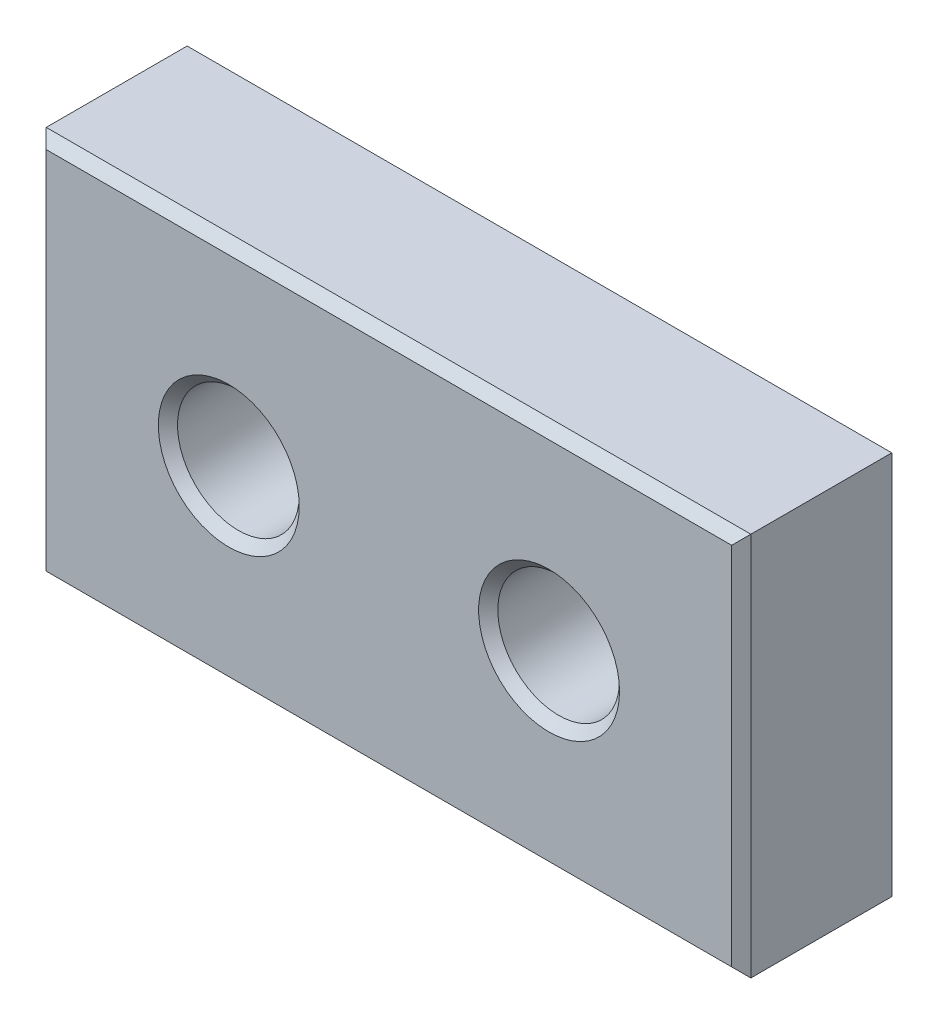
ISO-10303-21;
HEADER;
FILE_DESCRIPTION(('STEP AP214'),'2;1');
FILE_NAME('part.step','',(''),(''),'','','');
FILE_SCHEMA(('AUTOMOTIVE_DESIGN { 1 0 10303 214 1 1 1 1 }'));
ENDSEC;
DATA;
#1=APPLICATION_CONTEXT('core data for automotive mechanical design processes');
#2=APPLICATION_PROTOCOL_DEFINITION('international standard','automotive_design',2000,#1);
#3=PRODUCT_CONTEXT('',#1,'mechanical');
#4=PRODUCT('Part','Part','',(#3));
#5=PRODUCT_RELATED_PRODUCT_CATEGORY('part','',(#4));
#6=PRODUCT_DEFINITION_FORMATION('','',#4);
#7=PRODUCT_DEFINITION_CONTEXT('part definition',#1,'design');
#8=PRODUCT_DEFINITION('design','',#6,#7);
#9=PRODUCT_DEFINITION_SHAPE('','',#8);
#10=(LENGTH_UNIT() NAMED_UNIT(*) SI_UNIT(.MILLI.,.METRE.));
#11=(NAMED_UNIT(*) PLANE_ANGLE_UNIT() SI_UNIT($,.RADIAN.));
#12=(NAMED_UNIT(*) SI_UNIT($,.STERADIAN.) SOLID_ANGLE_UNIT());
#13=UNCERTAINTY_MEASURE_WITH_UNIT(LENGTH_MEASURE(1.E-05),#10,'distance_accuracy_value','');
#14=(GEOMETRIC_REPRESENTATION_CONTEXT(3) GLOBAL_UNCERTAINTY_ASSIGNED_CONTEXT((#13)) GLOBAL_UNIT_ASSIGNED_CONTEXT((#10,
#11,#12)) REPRESENTATION_CONTEXT('',''));
#15=CARTESIAN_POINT('',(0.,0.,0.));
#16=DIRECTION('',(0.,0.,1.));
#17=DIRECTION('',(1.,0.,0.));
#18=AXIS2_PLACEMENT_3D('',#15,#16,#17);
#19=CARTESIAN_POINT('',(0.,0.,5.));
#20=DIRECTION('',(0.,0.,1.));
#21=DIRECTION('',(1.,0.,0.));
#22=AXIS2_PLACEMENT_3D('',#19,#20,#21);
#23=PLANE('',#22);
#24=CARTESIAN_POINT('',(5.,0.,5.));
#25=DIRECTION('',(0.,0.,1.));
#26=DIRECTION('',(1.,0.,0.));
#27=AXIS2_PLACEMENT_3D('',#24,#25,#26);
#28=CIRCLE('',#27,2.2);
#29=CARTESIAN_POINT('',(7.2,0.,5.));
#30=VERTEX_POINT('',#29);
#31=EDGE_CURVE('E11',#30,#30,#28,.F.);
#32=ORIENTED_EDGE('',*,*,#31,.T.);
#33=EDGE_LOOP('',(#32));
#34=FACE_BOUND('',#33,.T.);
#35=DIRECTION('',(0.,-1.,0.));
#36=VECTOR('',#35,1.);
#37=CARTESIAN_POINT('',(-10.7,-6.,5.));
#38=LINE('',#37,#36);
#39=CARTESIAN_POINT('',(-10.7,5.69999999999999,5.));
#40=VERTEX_POINT('',#39);
#41=CARTESIAN_POINT('',(-10.7,-5.69999999999999,5.));
#42=VERTEX_POINT('',#41);
#43=EDGE_CURVE('E59',#40,#42,#38,.T.);
#44=ORIENTED_EDGE('',*,*,#43,.T.);
#45=DIRECTION('',(1.,0.,0.));
#46=VECTOR('',#45,1.);
#47=CARTESIAN_POINT('',(11.,-5.69999999999999,5.));
#48=LINE('',#47,#46);
#49=CARTESIAN_POINT('',(10.7,-5.69999999999999,5.));
#50=VERTEX_POINT('',#49);
#51=EDGE_CURVE('E51',#42,#50,#48,.T.);
#52=ORIENTED_EDGE('',*,*,#51,.T.);
#53=DIRECTION('',(0.,1.,0.));
#54=VECTOR('',#53,1.);
#55=CARTESIAN_POINT('',(10.7,6.,5.));
#56=LINE('',#55,#54);
#57=CARTESIAN_POINT('',(10.7,5.69999999999999,5.));
#58=VERTEX_POINT('',#57);
#59=EDGE_CURVE('E196',#50,#58,#56,.T.);
#60=ORIENTED_EDGE('',*,*,#59,.T.);
#61=DIRECTION('',(-1.,0.,0.));
#62=VECTOR('',#61,1.);
#63=CARTESIAN_POINT('',(-11.,5.69999999999999,5.));
#64=LINE('',#63,#62);
#65=EDGE_CURVE('E64',#58,#40,#64,.T.);
#66=ORIENTED_EDGE('',*,*,#65,.T.);
#67=EDGE_LOOP('',(#44,#52,#60,#66));
#68=FACE_BOUND('',#67,.T.);
#69=CARTESIAN_POINT('',(-5.,0.,5.));
#70=DIRECTION('',(0.,0.,1.));
#71=DIRECTION('',(1.,0.,0.));
#72=AXIS2_PLACEMENT_3D('',#69,#70,#71);
#73=CIRCLE('',#72,2.2);
#74=CARTESIAN_POINT('',(-2.8,0.,5.));
#75=VERTEX_POINT('',#74);
#76=EDGE_CURVE('E192',#75,#75,#73,.F.);
#77=ORIENTED_EDGE('',*,*,#76,.T.);
#78=EDGE_LOOP('',(#77));
#79=FACE_BOUND('',#78,.T.);
#80=ADVANCED_FACE('F40',(#34,#68,#79),#23,.T.);
#81=CARTESIAN_POINT('',(0.,0.,0.));
#82=DIRECTION('',(0.,0.,1.));
#83=DIRECTION('',(1.,0.,0.));
#84=AXIS2_PLACEMENT_3D('',#81,#82,#83);
#85=PLANE('',#84);
#86=CARTESIAN_POINT('',(5.,0.,0.));
#87=DIRECTION('',(0.,0.,1.));
#88=DIRECTION('',(1.,0.,0.));
#89=AXIS2_PLACEMENT_3D('',#86,#87,#88);
#90=CIRCLE('',#89,2.2);
#91=CARTESIAN_POINT('',(7.2,0.,0.));
#92=VERTEX_POINT('',#91);
#93=EDGE_CURVE('E144',#92,#92,#90,.T.);
#94=ORIENTED_EDGE('',*,*,#93,.T.);
#95=EDGE_LOOP('',(#94));
#96=FACE_BOUND('',#95,.T.);
#97=CARTESIAN_POINT('',(-5.,0.,0.));
#98=DIRECTION('',(0.,0.,1.));
#99=DIRECTION('',(1.,0.,0.));
#100=AXIS2_PLACEMENT_3D('',#97,#98,#99);
#101=CIRCLE('',#100,2.2);
#102=CARTESIAN_POINT('',(-2.8,0.,0.));
#103=VERTEX_POINT('',#102);
#104=EDGE_CURVE('E139',#103,#103,#101,.T.);
#105=ORIENTED_EDGE('',*,*,#104,.T.);
#106=EDGE_LOOP('',(#105));
#107=FACE_BOUND('',#106,.T.);
#108=DIRECTION('',(0.,1.,0.));
#109=VECTOR('',#108,1.);
#110=CARTESIAN_POINT('',(-10.7,0.,0.));
#111=LINE('',#110,#109);
#112=CARTESIAN_POINT('',(-10.7,-5.7,0.));
#113=VERTEX_POINT('',#112);
#114=CARTESIAN_POINT('',(-10.7,5.7,0.));
#115=VERTEX_POINT('',#114);
#116=EDGE_CURVE('E137',#113,#115,#111,.T.);
#117=ORIENTED_EDGE('',*,*,#116,.T.);
#118=DIRECTION('',(1.,0.,0.));
#119=VECTOR('',#118,1.);
#120=CARTESIAN_POINT('',(0.,5.7,0.));
#121=LINE('',#120,#119);
#122=CARTESIAN_POINT('',(10.7,5.7,0.));
#123=VERTEX_POINT('',#122);
#124=EDGE_CURVE('E114',#115,#123,#121,.T.);
#125=ORIENTED_EDGE('',*,*,#124,.T.);
#126=DIRECTION('',(0.,-1.,0.));
#127=VECTOR('',#126,1.);
#128=CARTESIAN_POINT('',(10.7,0.,0.));
#129=LINE('',#128,#127);
#130=CARTESIAN_POINT('',(10.7,-5.7,0.));
#131=VERTEX_POINT('',#130);
#132=EDGE_CURVE('E125',#123,#131,#129,.T.);
#133=ORIENTED_EDGE('',*,*,#132,.T.);
#134=DIRECTION('',(-1.,0.,0.));
#135=VECTOR('',#134,1.);
#136=CARTESIAN_POINT('',(0.,-5.7,0.));
#137=LINE('',#136,#135);
#138=EDGE_CURVE('E132',#131,#113,#137,.T.);
#139=ORIENTED_EDGE('',*,*,#138,.T.);
#140=EDGE_LOOP('',(#117,#125,#133,#139));
#141=FACE_BOUND('',#140,.T.);
#142=ADVANCED_FACE('F135',(#96,#107,#141),#85,.F.);
#143=CARTESIAN_POINT('',(11.,6.,5.));
#144=DIRECTION('',(-1.,0.,0.));
#145=DIRECTION('',(0.,0.,1.));
#146=AXIS2_PLACEMENT_3D('',#143,#144,#145);
#147=PLANE('',#146);
#148=DIRECTION('',(0.,0.,-1.));
#149=VECTOR('',#148,1.);
#150=CARTESIAN_POINT('',(11.,-6.,5.));
#151=LINE('',#150,#149);
#152=CARTESIAN_POINT('',(11.,-6.,4.69999999999999));
#153=VERTEX_POINT('',#152);
#154=CARTESIAN_POINT('',(11.,-6.,0.299999999999995));
#155=VERTEX_POINT('',#154);
#156=EDGE_CURVE('E212',#153,#155,#151,.T.);
#157=ORIENTED_EDGE('',*,*,#156,.T.);
#158=DIRECTION('',(0.,1.,0.));
#159=VECTOR('',#158,1.);
#160=CARTESIAN_POINT('',(11.,6.,0.299999999999995));
#161=LINE('',#160,#159);
#162=CARTESIAN_POINT('',(11.,6.,0.299999999999995));
#163=VERTEX_POINT('',#162);
#164=EDGE_CURVE('E189',#155,#163,#161,.T.);
#165=ORIENTED_EDGE('',*,*,#164,.T.);
#166=DIRECTION('',(0.,0.,-1.));
#167=VECTOR('',#166,1.);
#168=CARTESIAN_POINT('',(11.,6.,5.));
#169=LINE('',#168,#167);
#170=CARTESIAN_POINT('',(11.,6.,4.69999999999999));
#171=VERTEX_POINT('',#170);
#172=EDGE_CURVE('E133',#171,#163,#169,.T.);
#173=ORIENTED_EDGE('',*,*,#172,.F.);
#174=DIRECTION('',(0.,-1.,0.));
#175=VECTOR('',#174,1.);
#176=CARTESIAN_POINT('',(11.,-6.,4.69999999999999));
#177=LINE('',#176,#175);
#178=EDGE_CURVE('E186',#171,#153,#177,.T.);
#179=ORIENTED_EDGE('',*,*,#178,.T.);
#180=EDGE_LOOP('',(#157,#165,#173,#179));
#181=FACE_BOUND('',#180,.T.);
#182=ADVANCED_FACE('F242',(#181),#147,.F.);
#183=CARTESIAN_POINT('',(-11.,6.,5.));
#184=DIRECTION('',(0.,-1.,0.));
#185=DIRECTION('',(0.,0.,-1.));
#186=AXIS2_PLACEMENT_3D('',#183,#184,#185);
#187=PLANE('',#186);
#188=ORIENTED_EDGE('',*,*,#172,.T.);
#189=DIRECTION('',(-1.,0.,0.));
#190=VECTOR('',#189,1.);
#191=CARTESIAN_POINT('',(-11.,6.,0.299999999999995));
#192=LINE('',#191,#190);
#193=CARTESIAN_POINT('',(-11.,6.,0.299999999999995));
#194=VERTEX_POINT('',#193);
#195=EDGE_CURVE('E117',#163,#194,#192,.T.);
#196=ORIENTED_EDGE('',*,*,#195,.T.);
#197=DIRECTION('',(0.,0.,-1.));
#198=VECTOR('',#197,1.);
#199=CARTESIAN_POINT('',(-11.,6.,5.));
#200=LINE('',#199,#198);
#201=CARTESIAN_POINT('',(-11.,6.,4.69999999999999));
#202=VERTEX_POINT('',#201);
#203=EDGE_CURVE('E239',#202,#194,#200,.T.);
#204=ORIENTED_EDGE('',*,*,#203,.F.);
#205=DIRECTION('',(1.,0.,0.));
#206=VECTOR('',#205,1.);
#207=CARTESIAN_POINT('',(11.,6.,4.69999999999999));
#208=LINE('',#207,#206);
#209=EDGE_CURVE('E168',#202,#171,#208,.T.);
#210=ORIENTED_EDGE('',*,*,#209,.T.);
#211=EDGE_LOOP('',(#188,#196,#204,#210));
#212=FACE_BOUND('',#211,.T.);
#213=ADVANCED_FACE('F237',(#212),#187,.F.);
#214=CARTESIAN_POINT('',(-11.,6.,5.));
#215=DIRECTION('',(1.,0.,0.));
#216=DIRECTION('',(0.,0.,-1.));
#217=AXIS2_PLACEMENT_3D('',#214,#215,#216);
#218=PLANE('',#217);
#219=ORIENTED_EDGE('',*,*,#203,.T.);
#220=DIRECTION('',(0.,-1.,0.));
#221=VECTOR('',#220,1.);
#222=CARTESIAN_POINT('',(-11.,6.,0.299999999999995));
#223=LINE('',#222,#221);
#224=CARTESIAN_POINT('',(-11.,-6.,0.299999999999995));
#225=VERTEX_POINT('',#224);
#226=EDGE_CURVE('E176',#194,#225,#223,.T.);
#227=ORIENTED_EDGE('',*,*,#226,.T.);
#228=DIRECTION('',(0.,0.,-1.));
#229=VECTOR('',#228,1.);
#230=CARTESIAN_POINT('',(-11.,-6.,5.));
#231=LINE('',#230,#229);
#232=CARTESIAN_POINT('',(-11.,-6.,4.69999999999999));
#233=VERTEX_POINT('',#232);
#234=EDGE_CURVE('E247',#233,#225,#231,.T.);
#235=ORIENTED_EDGE('',*,*,#234,.F.);
#236=DIRECTION('',(0.,1.,0.));
#237=VECTOR('',#236,1.);
#238=CARTESIAN_POINT('',(-11.,6.,4.69999999999999));
#239=LINE('',#238,#237);
#240=EDGE_CURVE('E173',#233,#202,#239,.T.);
#241=ORIENTED_EDGE('',*,*,#240,.T.);
#242=EDGE_LOOP('',(#219,#227,#235,#241));
#243=FACE_BOUND('',#242,.T.);
#244=ADVANCED_FACE('F261',(#243),#218,.F.);
#245=CARTESIAN_POINT('',(-11.,-6.,5.));
#246=DIRECTION('',(0.,1.,0.));
#247=DIRECTION('',(0.,0.,1.));
#248=AXIS2_PLACEMENT_3D('',#245,#246,#247);
#249=PLANE('',#248);
#250=ORIENTED_EDGE('',*,*,#234,.T.);
#251=DIRECTION('',(1.,0.,0.));
#252=VECTOR('',#251,1.);
#253=CARTESIAN_POINT('',(-11.,-6.,0.299999999999995));
#254=LINE('',#253,#252);
#255=EDGE_CURVE('E183',#225,#155,#254,.T.);
#256=ORIENTED_EDGE('',*,*,#255,.T.);
#257=ORIENTED_EDGE('',*,*,#156,.F.);
#258=DIRECTION('',(-1.,0.,0.));
#259=VECTOR('',#258,1.);
#260=CARTESIAN_POINT('',(-11.,-6.,4.69999999999999));
#261=LINE('',#260,#259);
#262=EDGE_CURVE('E179',#153,#233,#261,.T.);
#263=ORIENTED_EDGE('',*,*,#262,.T.);
#264=EDGE_LOOP('',(#250,#256,#257,#263));
#265=FACE_BOUND('',#264,.T.);
#266=ADVANCED_FACE('F267',(#265),#249,.F.);
#267=CARTESIAN_POINT('',(-5.,0.,5.));
#268=DIRECTION('',(0.,0.,-1.));
#269=DIRECTION('',(-1.,0.,0.));
#270=AXIS2_PLACEMENT_3D('',#267,#268,#269);
#271=CYLINDRICAL_SURFACE('',#270,1.9);
#272=CARTESIAN_POINT('',(-5.,0.,0.300000000000003));
#273=DIRECTION('',(0.,0.,1.));
#274=DIRECTION('',(1.,0.,0.));
#275=AXIS2_PLACEMENT_3D('',#272,#273,#274);
#276=CIRCLE('',#275,1.9);
#277=CARTESIAN_POINT('',(-3.1,0.,0.300000000000003));
#278=VERTEX_POINT('',#277);
#279=EDGE_CURVE('E164',#278,#278,#276,.F.);
#280=ORIENTED_EDGE('',*,*,#279,.T.);
#281=EDGE_LOOP('',(#280));
#282=FACE_BOUND('',#281,.T.);
#283=CARTESIAN_POINT('',(-5.,0.,4.7));
#284=DIRECTION('',(0.,0.,1.));
#285=DIRECTION('',(1.,0.,0.));
#286=AXIS2_PLACEMENT_3D('',#283,#284,#285);
#287=CIRCLE('',#286,1.9);
#288=CARTESIAN_POINT('',(-3.1,0.,4.7));
#289=VERTEX_POINT('',#288);
#290=EDGE_CURVE('E160',#289,#289,#287,.T.);
#291=ORIENTED_EDGE('',*,*,#290,.T.);
#292=EDGE_LOOP('',(#291));
#293=FACE_BOUND('',#292,.T.);
#294=ADVANCED_FACE('F283',(#282,#293),#271,.F.);
#295=CARTESIAN_POINT('',(5.,0.,5.));
#296=DIRECTION('',(0.,0.,-1.));
#297=DIRECTION('',(-1.,0.,0.));
#298=AXIS2_PLACEMENT_3D('',#295,#296,#297);
#299=CYLINDRICAL_SURFACE('',#298,1.9);
#300=CARTESIAN_POINT('',(5.,0.,0.300000000000003));
#301=DIRECTION('',(0.,0.,1.));
#302=DIRECTION('',(1.,0.,0.));
#303=AXIS2_PLACEMENT_3D('',#300,#301,#302);
#304=CIRCLE('',#303,1.9);
#305=CARTESIAN_POINT('',(6.9,0.,0.300000000000003));
#306=VERTEX_POINT('',#305);
#307=EDGE_CURVE('E156',#306,#306,#304,.F.);
#308=ORIENTED_EDGE('',*,*,#307,.T.);
#309=EDGE_LOOP('',(#308));
#310=FACE_BOUND('',#309,.T.);
#311=CARTESIAN_POINT('',(5.,0.,4.7));
#312=DIRECTION('',(0.,0.,1.));
#313=DIRECTION('',(1.,0.,0.));
#314=AXIS2_PLACEMENT_3D('',#311,#312,#313);
#315=CIRCLE('',#314,1.9);
#316=CARTESIAN_POINT('',(6.9,0.,4.7));
#317=VERTEX_POINT('',#316);
#318=EDGE_CURVE('E152',#317,#317,#315,.T.);
#319=ORIENTED_EDGE('',*,*,#318,.T.);
#320=EDGE_LOOP('',(#319));
#321=FACE_BOUND('',#320,.T.);
#322=ADVANCED_FACE('F285',(#310,#321),#299,.F.);
#323=CARTESIAN_POINT('',(5.,0.,0.));
#324=DIRECTION('',(0.,0.,-1.));
#325=DIRECTION('',(-1.,0.,0.));
#326=AXIS2_PLACEMENT_3D('',#323,#324,#325);
#327=CONICAL_SURFACE('',#326,2.2,0.785398163397444);
#328=ORIENTED_EDGE('',*,*,#307,.F.);
#329=EDGE_LOOP('',(#328));
#330=FACE_BOUND('',#329,.T.);
#331=ORIENTED_EDGE('',*,*,#93,.F.);
#332=EDGE_LOOP('',(#331));
#333=FACE_BOUND('',#332,.T.);
#334=ADVANCED_FACE('F292',(#330,#333),#327,.F.);
#335=CARTESIAN_POINT('',(-5.,0.,0.));
#336=DIRECTION('',(0.,0.,-1.));
#337=DIRECTION('',(-1.,0.,0.));
#338=AXIS2_PLACEMENT_3D('',#335,#336,#337);
#339=CONICAL_SURFACE('',#338,2.2,0.785398163397445);
#340=ORIENTED_EDGE('',*,*,#279,.F.);
#341=EDGE_LOOP('',(#340));
#342=FACE_BOUND('',#341,.T.);
#343=ORIENTED_EDGE('',*,*,#104,.F.);
#344=EDGE_LOOP('',(#343));
#345=FACE_BOUND('',#344,.T.);
#346=ADVANCED_FACE('F312',(#342,#345),#339,.F.);
#347=CARTESIAN_POINT('',(-11.,-6.,0.299999999999995));
#348=DIRECTION('',(0.,0.707106781186543,0.707106781186552));
#349=DIRECTION('',(1.,0.,0.));
#350=AXIS2_PLACEMENT_3D('',#347,#348,#349);
#351=PLANE('',#350);
#352=DIRECTION('',(0.577350269189628,0.577350269189628,-0.577350269189622));
#353=VECTOR('',#352,1.);
#354=CARTESIAN_POINT('',(-11.,-6.,0.299999999999995));
#355=LINE('',#354,#353);
#356=EDGE_CURVE('E121',#113,#225,#355,.F.);
#357=ORIENTED_EDGE('',*,*,#356,.F.);
#358=ORIENTED_EDGE('',*,*,#138,.F.);
#359=DIRECTION('',(-0.577350269189628,0.577350269189628,-0.577350269189622));
#360=VECTOR('',#359,1.);
#361=CARTESIAN_POINT('',(6.99999999999997,-1.99999999999997,-3.69999999999999));
#362=LINE('',#361,#360);
#363=EDGE_CURVE('E128',#155,#131,#362,.T.);
#364=ORIENTED_EDGE('',*,*,#363,.F.);
#365=ORIENTED_EDGE('',*,*,#255,.F.);
#366=EDGE_LOOP('',(#357,#358,#364,#365));
#367=FACE_BOUND('',#366,.T.);
#368=ADVANCED_FACE('F254',(#367),#351,.F.);
#369=CARTESIAN_POINT('',(11.,6.,0.299999999999995));
#370=DIRECTION('',(-0.707106781186543,0.,0.707106781186552));
#371=DIRECTION('',(0.,1.,0.));
#372=AXIS2_PLACEMENT_3D('',#369,#370,#371);
#373=PLANE('',#372);
#374=ORIENTED_EDGE('',*,*,#363,.T.);
#375=ORIENTED_EDGE('',*,*,#132,.F.);
#376=DIRECTION('',(0.577350269189628,0.577350269189628,0.577350269189622));
#377=VECTOR('',#376,1.);
#378=CARTESIAN_POINT('',(11.,6.,0.299999999999995));
#379=LINE('',#378,#377);
#380=EDGE_CURVE('E110',#163,#123,#379,.F.);
#381=ORIENTED_EDGE('',*,*,#380,.F.);
#382=ORIENTED_EDGE('',*,*,#164,.F.);
#383=EDGE_LOOP('',(#374,#375,#381,#382));
#384=FACE_BOUND('',#383,.T.);
#385=ADVANCED_FACE('F126',(#384),#373,.F.);
#386=CARTESIAN_POINT('',(-11.,6.,0.299999999999995));
#387=DIRECTION('',(0.707106781186543,0.,0.707106781186552));
#388=DIRECTION('',(0.,-1.,0.));
#389=AXIS2_PLACEMENT_3D('',#386,#387,#388);
#390=PLANE('',#389);
#391=ORIENTED_EDGE('',*,*,#356,.T.);
#392=ORIENTED_EDGE('',*,*,#226,.F.);
#393=DIRECTION('',(0.577350269189628,-0.577350269189628,-0.577350269189622));
#394=VECTOR('',#393,1.);
#395=CARTESIAN_POINT('',(-11.,6.,0.299999999999995));
#396=LINE('',#395,#394);
#397=EDGE_CURVE('E122',#115,#194,#396,.F.);
#398=ORIENTED_EDGE('',*,*,#397,.F.);
#399=ORIENTED_EDGE('',*,*,#116,.F.);
#400=EDGE_LOOP('',(#391,#392,#398,#399));
#401=FACE_BOUND('',#400,.T.);
#402=ADVANCED_FACE('F257',(#401),#390,.F.);
#403=CARTESIAN_POINT('',(-11.,6.,0.299999999999995));
#404=DIRECTION('',(0.,-0.707106781186543,0.707106781186552));
#405=DIRECTION('',(-1.,0.,0.));
#406=AXIS2_PLACEMENT_3D('',#403,#404,#405);
#407=PLANE('',#406);
#408=ORIENTED_EDGE('',*,*,#380,.T.);
#409=ORIENTED_EDGE('',*,*,#124,.F.);
#410=ORIENTED_EDGE('',*,*,#397,.T.);
#411=ORIENTED_EDGE('',*,*,#195,.F.);
#412=EDGE_LOOP('',(#408,#409,#410,#411));
#413=FACE_BOUND('',#412,.T.);
#414=ADVANCED_FACE('F112',(#413),#407,.F.);
#415=CARTESIAN_POINT('',(5.,0.,4.7));
#416=DIRECTION('',(0.,0.,1.));
#417=DIRECTION('',(1.,0.,0.));
#418=AXIS2_PLACEMENT_3D('',#415,#416,#417);
#419=CONICAL_SURFACE('',#418,1.9,0.785398163397447);
#420=CARTESIAN_POINT('',(7.2,0.,5.));
#421=CARTESIAN_POINT('',(7.196875,0.,4.996875));
#422=CARTESIAN_POINT('',(7.19375,0.,4.99375));
#423=CARTESIAN_POINT('',(7.1875,0.,4.9875));
#424=CARTESIAN_POINT('',(7.184375,0.,4.984375));
#425=CARTESIAN_POINT('',(7.178125,0.,4.978125));
#426=CARTESIAN_POINT('',(7.175,0.,4.975));
#427=CARTESIAN_POINT('',(7.16875,0.,4.96875));
#428=CARTESIAN_POINT('',(7.165625,0.,4.965625));
#429=CARTESIAN_POINT('',(7.159375,0.,4.959375));
#430=CARTESIAN_POINT('',(7.15625,0.,4.95625));
#431=CARTESIAN_POINT('',(7.15,0.,4.95));
#432=CARTESIAN_POINT('',(7.146875,0.,4.946875));
#433=CARTESIAN_POINT('',(7.140625,0.,4.940625));
#434=CARTESIAN_POINT('',(7.1375,0.,4.9375));
#435=CARTESIAN_POINT('',(7.13125,0.,4.93125));
#436=CARTESIAN_POINT('',(7.128125,0.,4.928125));
#437=CARTESIAN_POINT('',(7.121875,0.,4.921875));
#438=CARTESIAN_POINT('',(7.11875,0.,4.91875));
#439=CARTESIAN_POINT('',(7.1125,0.,4.9125));
#440=CARTESIAN_POINT('',(7.109375,0.,4.909375));
#441=CARTESIAN_POINT('',(7.103125,0.,4.903125));
#442=CARTESIAN_POINT('',(7.1,0.,4.9));
#443=CARTESIAN_POINT('',(7.09375,0.,4.89375));
#444=CARTESIAN_POINT('',(7.090625,0.,4.890625));
#445=CARTESIAN_POINT('',(7.084375,0.,4.884375));
#446=CARTESIAN_POINT('',(7.08125,0.,4.88125));
#447=CARTESIAN_POINT('',(7.075,0.,4.875));
#448=CARTESIAN_POINT('',(7.071875,0.,4.871875));
#449=CARTESIAN_POINT('',(7.065625,0.,4.865625));
#450=CARTESIAN_POINT('',(7.0625,0.,4.8625));
#451=CARTESIAN_POINT('',(7.05625,0.,4.85625));
#452=CARTESIAN_POINT('',(7.053125,0.,4.853125));
#453=CARTESIAN_POINT('',(7.046875,0.,4.846875));
#454=CARTESIAN_POINT('',(7.04375,0.,4.84375));
#455=CARTESIAN_POINT('',(7.0375,0.,4.8375));
#456=CARTESIAN_POINT('',(7.034375,0.,4.834375));
#457=CARTESIAN_POINT('',(7.028125,0.,4.828125));
#458=CARTESIAN_POINT('',(7.025,0.,4.825));
#459=CARTESIAN_POINT('',(7.01875,0.,4.81875));
#460=CARTESIAN_POINT('',(7.015625,0.,4.815625));
#461=CARTESIAN_POINT('',(7.009375,0.,4.809375));
#462=CARTESIAN_POINT('',(7.00625,0.,4.80625));
#463=CARTESIAN_POINT('',(7.,0.,4.8));
#464=CARTESIAN_POINT('',(6.996875,0.,4.796875));
#465=CARTESIAN_POINT('',(6.990625,0.,4.790625));
#466=CARTESIAN_POINT('',(6.9875,0.,4.7875));
#467=CARTESIAN_POINT('',(6.98125,0.,4.78125));
#468=CARTESIAN_POINT('',(6.978125,0.,4.778125));
#469=CARTESIAN_POINT('',(6.971875,0.,4.771875));
#470=CARTESIAN_POINT('',(6.96875,0.,4.76875));
#471=CARTESIAN_POINT('',(6.9625,0.,4.7625));
#472=CARTESIAN_POINT('',(6.959375,0.,4.759375));
#473=CARTESIAN_POINT('',(6.953125,0.,4.753125));
#474=CARTESIAN_POINT('',(6.95,0.,4.75));
#475=CARTESIAN_POINT('',(6.94375,0.,4.74375));
#476=CARTESIAN_POINT('',(6.940625,0.,4.740625));
#477=CARTESIAN_POINT('',(6.934375,0.,4.734375));
#478=CARTESIAN_POINT('',(6.93125,0.,4.73125));
#479=CARTESIAN_POINT('',(6.925,0.,4.725));
#480=CARTESIAN_POINT('',(6.921875,0.,4.721875));
#481=CARTESIAN_POINT('',(6.915625,0.,4.715625));
#482=CARTESIAN_POINT('',(6.9125,0.,4.7125));
#483=CARTESIAN_POINT('',(6.90625,0.,4.70625));
#484=CARTESIAN_POINT('',(6.903125,0.,4.703125));
#485=CARTESIAN_POINT('',(6.9,0.,4.7));
#486=B_SPLINE_CURVE_WITH_KNOTS('',3,(#420,#421,#422,#423,#424,#425,#426,#427,#428,#429,#430,
#431,#432,#433,#434,#435,#436,#437,#438,#439,#440,#441,#442,#443,#444,#445,#446,#447,#448,#449,
#450,#451,#452,#453,#454,#455,#456,#457,#458,#459,#460,#461,#462,#463,#464,#465,#466,#467,#468,
#469,#470,#471,#472,#473,#474,#475,#476,#477,#478,#479,#480,#481,#482,#483,#484,#485),
.UNSPECIFIED.,.F.,.F.,(4,2,2,2,2,2,2,2,2,2,2,2,2,2,2,2,2,2,2,2,2,2,2,2,2,2,2,2,2,2,2,2,4),(0.,
0.0132582521472475,0.0265165042944957,0.0397747564417432,0.0530330085889908,0.0662912607362395,
0.0795495128834864,0.0928077650307346,0.106066017177982,0.11932426932523,0.132582521472478,
0.145840773619725,0.159099025766973,0.172357277914221,0.185615530061469,0.198873782208717,
0.212132034355964,0.225390286503212,0.238648538650459,0.251906790797708,0.265165042944956,
0.278423295092203,0.291681547239451,0.304939799386699,0.318198051533947,0.331456303681194,
0.344714555828442,0.357972807975689,0.371231060122938,0.384489312270186,0.397747564417433,
0.411005816564681,0.424264068711928),.UNSPECIFIED.);
#487=EDGE_CURVE('BSEAM327',#30,#317,#486,.T.);
#488=ORIENTED_EDGE('',*,*,#31,.F.);
#489=ORIENTED_EDGE('',*,*,#318,.F.);
#490=ORIENTED_EDGE('',*,*,#487,.T.);
#491=ORIENTED_EDGE('',*,*,#487,.F.);
#492=EDGE_LOOP('',(#488,#490,#489,#491));
#493=FACE_BOUND('',#492,.T.);
#494=ADVANCED_FACE('F327',(#493),#419,.F.);
#495=CARTESIAN_POINT('',(0.,5.69999999999999,5.));
#496=DIRECTION('',(0.,0.707106781186552,0.707106781186543));
#497=DIRECTION('',(1.,0.,0.));
#498=AXIS2_PLACEMENT_3D('',#495,#496,#497);
#499=PLANE('',#498);
#500=DIRECTION('',(-0.577350269189624,-0.577350269189624,0.57735026918963));
#501=VECTOR('',#500,1.);
#502=CARTESIAN_POINT('',(8.80000000000001,3.80000000000001,6.9));
#503=LINE('',#502,#501);
#504=EDGE_CURVE('E218',#171,#58,#503,.T.);
#505=ORIENTED_EDGE('',*,*,#504,.F.);
#506=ORIENTED_EDGE('',*,*,#209,.F.);
#507=DIRECTION('',(0.577350269189624,-0.577350269189624,0.57735026918963));
#508=VECTOR('',#507,1.);
#509=CARTESIAN_POINT('',(-7.13333333333336,2.13333333333336,8.56666666666668));
#510=LINE('',#509,#508);
#511=EDGE_CURVE('E45',#40,#202,#510,.F.);
#512=ORIENTED_EDGE('',*,*,#511,.F.);
#513=ORIENTED_EDGE('',*,*,#65,.F.);
#514=EDGE_LOOP('',(#505,#506,#512,#513));
#515=FACE_BOUND('',#514,.T.);
#516=ADVANCED_FACE('F232',(#515),#499,.T.);
#517=CARTESIAN_POINT('',(-10.7,0.,5.));
#518=DIRECTION('',(-0.707106781186552,0.,0.707106781186543));
#519=DIRECTION('',(0.,1.,0.));
#520=AXIS2_PLACEMENT_3D('',#517,#518,#519);
#521=PLANE('',#520);
#522=ORIENTED_EDGE('',*,*,#511,.T.);
#523=ORIENTED_EDGE('',*,*,#240,.F.);
#524=DIRECTION('',(0.577350269189624,0.577350269189624,0.57735026918963));
#525=VECTOR('',#524,1.);
#526=CARTESIAN_POINT('',(-8.80000000000001,-3.80000000000001,6.9));
#527=LINE('',#526,#525);
#528=EDGE_CURVE('E216',#42,#233,#527,.F.);
#529=ORIENTED_EDGE('',*,*,#528,.F.);
#530=ORIENTED_EDGE('',*,*,#43,.F.);
#531=EDGE_LOOP('',(#522,#523,#529,#530));
#532=FACE_BOUND('',#531,.T.);
#533=ADVANCED_FACE('F229',(#532),#521,.T.);
#534=CARTESIAN_POINT('',(10.7,0.,5.));
#535=DIRECTION('',(0.707106781186552,0.,0.707106781186543));
#536=DIRECTION('',(0.,-1.,0.));
#537=AXIS2_PLACEMENT_3D('',#534,#535,#536);
#538=PLANE('',#537);
#539=ORIENTED_EDGE('',*,*,#504,.T.);
#540=ORIENTED_EDGE('',*,*,#59,.F.);
#541=DIRECTION('',(0.577350269189624,-0.577350269189624,-0.57735026918963));
#542=VECTOR('',#541,1.);
#543=CARTESIAN_POINT('',(8.80000000000001,-3.80000000000001,6.9));
#544=LINE('',#543,#542);
#545=EDGE_CURVE('E213',#153,#50,#544,.F.);
#546=ORIENTED_EDGE('',*,*,#545,.F.);
#547=ORIENTED_EDGE('',*,*,#178,.F.);
#548=EDGE_LOOP('',(#539,#540,#546,#547));
#549=FACE_BOUND('',#548,.T.);
#550=ADVANCED_FACE('F272',(#549),#538,.T.);
#551=CARTESIAN_POINT('',(0.,-5.69999999999999,5.));
#552=DIRECTION('',(0.,-0.707106781186552,0.707106781186543));
#553=DIRECTION('',(-1.,0.,0.));
#554=AXIS2_PLACEMENT_3D('',#551,#552,#553);
#555=PLANE('',#554);
#556=ORIENTED_EDGE('',*,*,#528,.T.);
#557=ORIENTED_EDGE('',*,*,#262,.F.);
#558=ORIENTED_EDGE('',*,*,#545,.T.);
#559=ORIENTED_EDGE('',*,*,#51,.F.);
#560=EDGE_LOOP('',(#556,#557,#558,#559));
#561=FACE_BOUND('',#560,.T.);
#562=ADVANCED_FACE('F270',(#561),#555,.T.);
#563=CARTESIAN_POINT('',(-5.,0.,4.7));
#564=DIRECTION('',(0.,0.,1.));
#565=DIRECTION('',(1.,0.,0.));
#566=AXIS2_PLACEMENT_3D('',#563,#564,#565);
#567=CONICAL_SURFACE('',#566,1.9,0.785398163397447);
#568=ORIENTED_EDGE('',*,*,#76,.F.);
#569=EDGE_LOOP('',(#568));
#570=FACE_BOUND('',#569,.T.);
#571=ORIENTED_EDGE('',*,*,#290,.F.);
#572=EDGE_LOOP('',(#571));
#573=FACE_BOUND('',#572,.T.);
#574=ADVANCED_FACE('F43',(#570,#573),#567,.F.);
#575=CLOSED_SHELL('',(#80,#142,#182,#213,#244,#266,#294,#322,#334,#346,#368,#385,#402,#414,#494,
#516,#533,#550,#562,#574));
#576=MANIFOLD_SOLID_BREP('B2',#575);
#577=ADVANCED_BREP_SHAPE_REPRESENTATION('',(#18,#576),#14);
#578=SHAPE_DEFINITION_REPRESENTATION(#9,#577);
ENDSEC;
END-ISO-10303-21;
